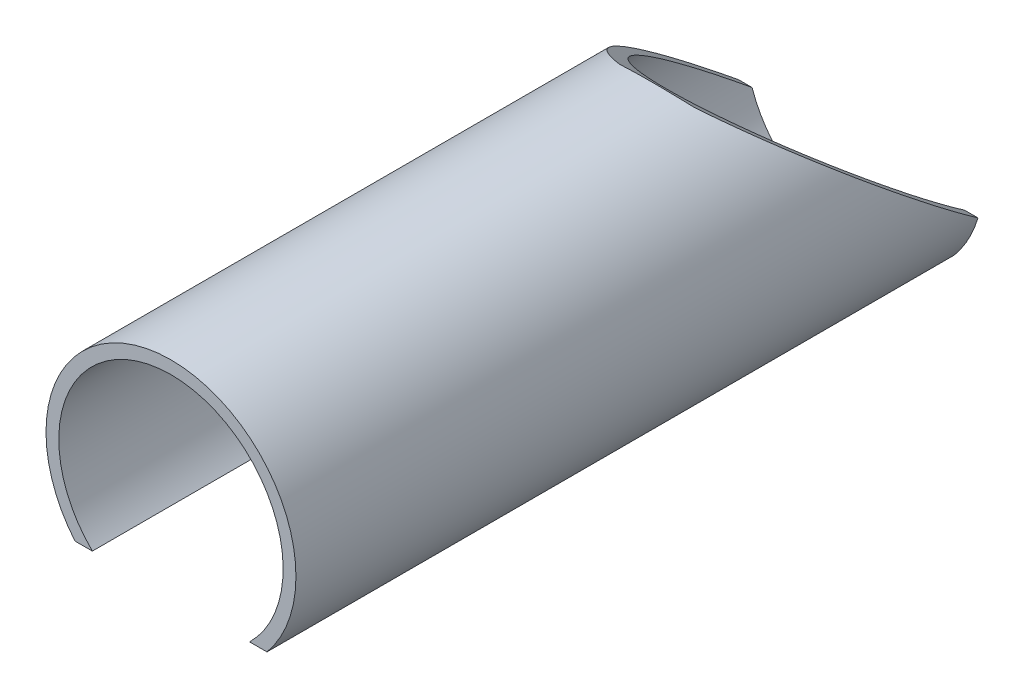
ISO-10303-21;
HEADER;
FILE_DESCRIPTION(('STEP AP214'),'2;1');
FILE_NAME('part.step','',(''),(''),'','','');
FILE_SCHEMA(('AUTOMOTIVE_DESIGN { 1 0 10303 214 1 1 1 1 }'));
ENDSEC;
DATA;
#1=APPLICATION_CONTEXT('core data for automotive mechanical design processes');
#2=APPLICATION_PROTOCOL_DEFINITION('international standard','automotive_design',2000,#1);
#3=PRODUCT_CONTEXT('',#1,'mechanical');
#4=PRODUCT('Part','Part','',(#3));
#5=PRODUCT_RELATED_PRODUCT_CATEGORY('part','',(#4));
#6=PRODUCT_DEFINITION_FORMATION('','',#4);
#7=PRODUCT_DEFINITION_CONTEXT('part definition',#1,'design');
#8=PRODUCT_DEFINITION('design','',#6,#7);
#9=PRODUCT_DEFINITION_SHAPE('','',#8);
#10=(LENGTH_UNIT() NAMED_UNIT(*) SI_UNIT(.MILLI.,.METRE.));
#11=(NAMED_UNIT(*) PLANE_ANGLE_UNIT() SI_UNIT($,.RADIAN.));
#12=(NAMED_UNIT(*) SI_UNIT($,.STERADIAN.) SOLID_ANGLE_UNIT());
#13=UNCERTAINTY_MEASURE_WITH_UNIT(LENGTH_MEASURE(1.E-05),#10,'distance_accuracy_value','');
#14=(GEOMETRIC_REPRESENTATION_CONTEXT(3) GLOBAL_UNCERTAINTY_ASSIGNED_CONTEXT((#13)) GLOBAL_UNIT_ASSIGNED_CONTEXT((#10,
#11,#12)) REPRESENTATION_CONTEXT('',''));
#15=CARTESIAN_POINT('',(0.,0.,0.));
#16=DIRECTION('',(0.,0.,1.));
#17=DIRECTION('',(1.,0.,0.));
#18=AXIS2_PLACEMENT_3D('',#15,#16,#17);
#19=CARTESIAN_POINT('',(0.,0.,0.));
#20=DIRECTION('',(0.,0.,1.));
#21=DIRECTION('',(1.,0.,0.));
#22=AXIS2_PLACEMENT_3D('',#19,#20,#21);
#23=PLANE('',#22);
#24=CARTESIAN_POINT('',(0.,0.,0.));
#25=DIRECTION('',(0.,0.,1.));
#26=DIRECTION('',(1.,0.,0.));
#27=AXIS2_PLACEMENT_3D('',#24,#25,#26);
#28=CIRCLE('',#27,16.);
#29=CARTESIAN_POINT('',(-15.323253459695,-4.60411809252802,0.));
#30=VERTEX_POINT('',#29);
#31=CARTESIAN_POINT('',(-12.2910717549572,-10.2435128307867,0.));
#32=VERTEX_POINT('',#31);
#33=EDGE_CURVE('E126',#30,#32,#28,.T.);
#34=ORIENTED_EDGE('',*,*,#33,.F.);
#35=DIRECTION('',(1.,0.,0.));
#36=VECTOR('',#35,1.);
#37=CARTESIAN_POINT('',(0.,-4.60411809252802,0.));
#38=LINE('',#37,#36);
#39=CARTESIAN_POINT('',(-13.6023942777689,-4.60411809252802,0.));
#40=VERTEX_POINT('',#39);
#41=EDGE_CURVE('E97',#30,#40,#38,.T.);
#42=ORIENTED_EDGE('',*,*,#41,.T.);
#43=CARTESIAN_POINT('',(0.,0.,0.));
#44=DIRECTION('',(0.,0.,1.));
#45=DIRECTION('',(1.,0.,0.));
#46=AXIS2_PLACEMENT_3D('',#43,#44,#45);
#47=CIRCLE('',#46,14.3604677325574);
#48=CARTESIAN_POINT('',(-10.0644661251023,-10.2435128307867,0.));
#49=VERTEX_POINT('',#48);
#50=EDGE_CURVE('E127',#40,#49,#47,.T.);
#51=ORIENTED_EDGE('',*,*,#50,.T.);
#52=DIRECTION('',(1.,0.,0.));
#53=VECTOR('',#52,1.);
#54=CARTESIAN_POINT('',(-19.6651176515177,-10.2435128307867,0.));
#55=LINE('',#54,#53);
#56=EDGE_CURVE('E115',#32,#49,#55,.T.);
#57=ORIENTED_EDGE('',*,*,#56,.F.);
#58=EDGE_LOOP('',(#34,#42,#51,#57));
#59=FACE_BOUND('',#58,.T.);
#60=ADVANCED_FACE('F34',(#59),#23,.F.);
#61=CARTESIAN_POINT('',(0.,0.,88.));
#62=DIRECTION('',(0.,0.,-1.));
#63=DIRECTION('',(-1.,0.,0.));
#64=AXIS2_PLACEMENT_3D('',#61,#62,#63);
#65=CYLINDRICAL_SURFACE('',#64,16.);
#66=CARTESIAN_POINT('',(12.2910717549572,-10.2435128307867,0.));
#67=VERTEX_POINT('',#66);
#68=CARTESIAN_POINT('',(15.323253459695,-4.60411809252802,0.));
#69=VERTEX_POINT('',#68);
#70=EDGE_CURVE('E109',#67,#69,#28,.T.);
#71=ORIENTED_EDGE('',*,*,#70,.T.);
#72=CARTESIAN_POINT('',(0.,0.,5.97411895194426));
#73=DIRECTION('',(0.,-0.792069937687795,0.610430351318848));
#74=DIRECTION('',(0.,-0.610430351318848,-0.792069937687795));
#75=AXIS2_PLACEMENT_3D('',#72,#73,#74);
#76=ELLIPSE('',#75,26.2110164827677,16.);
#77=CARTESIAN_POINT('',(4.73690627835601,15.2827261609332,25.8043713826055));
#78=VERTEX_POINT('',#77);
#79=EDGE_CURVE('E100',#69,#78,#76,.T.);
#80=ORIENTED_EDGE('',*,*,#79,.T.);
#81=CARTESIAN_POINT('',(0.,0.,12.73886623385));
#82=DIRECTION('',(0.,-0.649816759552955,0.760090901803263));
#83=DIRECTION('',(0.,-0.760090901803263,-0.649816759552955));
#84=AXIS2_PLACEMENT_3D('',#81,#82,#83);
#85=ELLIPSE('',#84,21.050113824598,16.);
#86=CARTESIAN_POINT('',(-4.73690627835602,15.2827261609332,25.8043713826055));
#87=VERTEX_POINT('',#86);
#88=EDGE_CURVE('E11',#78,#87,#85,.T.);
#89=ORIENTED_EDGE('',*,*,#88,.T.);
#90=EDGE_CURVE('E92',#87,#30,#76,.T.);
#91=ORIENTED_EDGE('',*,*,#90,.T.);
#92=ORIENTED_EDGE('',*,*,#33,.T.);
#93=DIRECTION('',(0.,0.,-1.));
#94=VECTOR('',#93,1.);
#95=CARTESIAN_POINT('',(-12.2910717549572,-10.2435128307867,88.));
#96=LINE('',#95,#94);
#97=CARTESIAN_POINT('',(-12.2910717549572,-10.2435128307867,88.));
#98=VERTEX_POINT('',#97);
#99=EDGE_CURVE('E119',#98,#32,#96,.T.);
#100=ORIENTED_EDGE('',*,*,#99,.F.);
#101=CARTESIAN_POINT('',(0.,0.,88.));
#102=DIRECTION('',(0.,0.,1.));
#103=DIRECTION('',(1.,0.,0.));
#104=AXIS2_PLACEMENT_3D('',#101,#102,#103);
#105=CIRCLE('',#104,16.);
#106=CARTESIAN_POINT('',(12.2910717549572,-10.2435128307867,88.));
#107=VERTEX_POINT('',#106);
#108=EDGE_CURVE('E130',#107,#98,#105,.T.);
#109=ORIENTED_EDGE('',*,*,#108,.F.);
#110=DIRECTION('',(0.,0.,-1.));
#111=VECTOR('',#110,1.);
#112=CARTESIAN_POINT('',(12.2910717549572,-10.2435128307867,88.));
#113=LINE('',#112,#111);
#114=EDGE_CURVE('E117',#67,#107,#113,.F.);
#115=ORIENTED_EDGE('',*,*,#114,.F.);
#116=EDGE_LOOP('',(#71,#80,#89,#91,#92,#100,#109,#115));
#117=FACE_BOUND('',#116,.T.);
#118=ADVANCED_FACE('F36',(#117),#65,.T.);
#119=CARTESIAN_POINT('',(0.,0.,88.));
#120=DIRECTION('',(0.,0.,1.));
#121=DIRECTION('',(1.,0.,0.));
#122=AXIS2_PLACEMENT_3D('',#119,#120,#121);
#123=PLANE('',#122);
#124=ORIENTED_EDGE('',*,*,#108,.T.);
#125=DIRECTION('',(1.,0.,0.));
#126=VECTOR('',#125,1.);
#127=CARTESIAN_POINT('',(-19.6651176515177,-10.2435128307867,88.));
#128=LINE('',#127,#126);
#129=CARTESIAN_POINT('',(-10.0644661251023,-10.2435128307867,88.));
#130=VERTEX_POINT('',#129);
#131=EDGE_CURVE('E110',#98,#130,#128,.T.);
#132=ORIENTED_EDGE('',*,*,#131,.T.);
#133=CARTESIAN_POINT('',(0.,0.,88.));
#134=DIRECTION('',(0.,0.,1.));
#135=DIRECTION('',(1.,0.,0.));
#136=AXIS2_PLACEMENT_3D('',#133,#134,#135);
#137=CIRCLE('',#136,14.3604677325574);
#138=CARTESIAN_POINT('',(10.0644661251023,-10.2435128307867,88.));
#139=VERTEX_POINT('',#138);
#140=EDGE_CURVE('E122',#139,#130,#137,.T.);
#141=ORIENTED_EDGE('',*,*,#140,.F.);
#142=EDGE_CURVE('E57',#139,#107,#128,.T.);
#143=ORIENTED_EDGE('',*,*,#142,.T.);
#144=EDGE_LOOP('',(#124,#132,#141,#143));
#145=FACE_BOUND('',#144,.T.);
#146=ADVANCED_FACE('F150',(#145),#123,.T.);
#147=CARTESIAN_POINT('',(10.0644661251023,-10.2435128307867,0.));
#148=VERTEX_POINT('',#147);
#149=CARTESIAN_POINT('',(13.6023942777689,-4.60411809252802,0.));
#150=VERTEX_POINT('',#149);
#151=EDGE_CURVE('E123',#148,#150,#47,.T.);
#152=ORIENTED_EDGE('',*,*,#151,.T.);
#153=EDGE_CURVE('E49',#150,#69,#38,.T.);
#154=ORIENTED_EDGE('',*,*,#153,.T.);
#155=ORIENTED_EDGE('',*,*,#70,.F.);
#156=EDGE_CURVE('E114',#148,#67,#55,.T.);
#157=ORIENTED_EDGE('',*,*,#156,.F.);
#158=EDGE_LOOP('',(#152,#154,#155,#157));
#159=FACE_BOUND('',#158,.T.);
#160=ADVANCED_FACE('F144',(#159),#23,.F.);
#161=CARTESIAN_POINT('',(0.,0.,0.));
#162=DIRECTION('',(0.,0.,1.));
#163=DIRECTION('',(1.,0.,0.));
#164=AXIS2_PLACEMENT_3D('',#161,#162,#163);
#165=CYLINDRICAL_SURFACE('',#164,14.3604677325574);
#166=ORIENTED_EDGE('',*,*,#50,.F.);
#167=CARTESIAN_POINT('',(0.,0.,5.97411895194426));
#168=DIRECTION('',(0.,-0.792069937687795,0.610430351318848));
#169=DIRECTION('',(0.,0.610430351318848,0.792069937687795));
#170=AXIS2_PLACEMENT_3D('',#167,#168,#169);
#171=ELLIPSE('',#170,23.5251535273948,14.3604677325574);
#172=EDGE_CURVE('E42',#40,#150,#171,.F.);
#173=ORIENTED_EDGE('',*,*,#172,.T.);
#174=ORIENTED_EDGE('',*,*,#151,.F.);
#175=DIRECTION('',(0.,0.,1.));
#176=VECTOR('',#175,1.);
#177=CARTESIAN_POINT('',(10.0644661251023,-10.2435128307867,0.));
#178=LINE('',#177,#176);
#179=EDGE_CURVE('E136',#139,#148,#178,.F.);
#180=ORIENTED_EDGE('',*,*,#179,.F.);
#181=ORIENTED_EDGE('',*,*,#140,.T.);
#182=DIRECTION('',(0.,0.,1.));
#183=VECTOR('',#182,1.);
#184=CARTESIAN_POINT('',(-10.0644661251023,-10.2435128307867,0.));
#185=LINE('',#184,#183);
#186=EDGE_CURVE('E133',#49,#130,#185,.T.);
#187=ORIENTED_EDGE('',*,*,#186,.F.);
#188=EDGE_LOOP('',(#166,#173,#174,#180,#181,#187));
#189=FACE_BOUND('',#188,.T.);
#190=ADVANCED_FACE('F140',(#189),#165,.F.);
#191=CARTESIAN_POINT('',(-19.6651176515177,-10.2435128307867,0.));
#192=DIRECTION('',(0.,-1.,0.));
#193=DIRECTION('',(0.,0.,-1.));
#194=AXIS2_PLACEMENT_3D('',#191,#192,#193);
#195=PLANE('',#194);
#196=ORIENTED_EDGE('',*,*,#99,.T.);
#197=ORIENTED_EDGE('',*,*,#56,.T.);
#198=ORIENTED_EDGE('',*,*,#186,.T.);
#199=ORIENTED_EDGE('',*,*,#131,.F.);
#200=EDGE_LOOP('',(#196,#197,#198,#199));
#201=FACE_BOUND('',#200,.T.);
#202=ADVANCED_FACE('F154',(#201),#195,.T.);
#203=ORIENTED_EDGE('',*,*,#114,.T.);
#204=ORIENTED_EDGE('',*,*,#142,.F.);
#205=ORIENTED_EDGE('',*,*,#179,.T.);
#206=ORIENTED_EDGE('',*,*,#156,.T.);
#207=EDGE_LOOP('',(#203,#204,#205,#206));
#208=FACE_BOUND('',#207,.T.);
#209=ADVANCED_FACE('F145',(#208),#195,.T.);
#210=CARTESIAN_POINT('',(-16.,20.4329158965848,30.2073705464743));
#211=DIRECTION('',(0.,-0.649816759552955,0.760090901803263));
#212=DIRECTION('',(0.,-0.760090901803263,-0.649816759552955));
#213=AXIS2_PLACEMENT_3D('',#210,#211,#212);
#214=PLANE('',#213);
#215=DIRECTION('',(1.,0.,0.));
#216=VECTOR('',#215,1.);
#217=CARTESIAN_POINT('',(-16.,15.2827261609332,25.8043713826055));
#218=LINE('',#217,#216);
#219=EDGE_CURVE('E95',#87,#78,#218,.T.);
#220=ORIENTED_EDGE('',*,*,#219,.F.);
#221=ORIENTED_EDGE('',*,*,#88,.F.);
#222=EDGE_LOOP('',(#220,#221));
#223=FACE_BOUND('',#222,.T.);
#224=ADVANCED_FACE('F104',(#223),#214,.F.);
#225=CARTESIAN_POINT('',(-16.,-11.5889632157931,-9.06325484896087));
#226=DIRECTION('',(0.,-0.792069937687795,0.610430351318848));
#227=DIRECTION('',(0.,-0.610430351318848,-0.792069937687795));
#228=AXIS2_PLACEMENT_3D('',#225,#226,#227);
#229=PLANE('',#228);
#230=ORIENTED_EDGE('',*,*,#79,.F.);
#231=ORIENTED_EDGE('',*,*,#153,.F.);
#232=ORIENTED_EDGE('',*,*,#172,.F.);
#233=ORIENTED_EDGE('',*,*,#41,.F.);
#234=ORIENTED_EDGE('',*,*,#90,.F.);
#235=ORIENTED_EDGE('',*,*,#219,.T.);
#236=EDGE_LOOP('',(#230,#231,#232,#233,#234,#235));
#237=FACE_BOUND('',#236,.T.);
#238=ADVANCED_FACE('F94',(#237),#229,.F.);
#239=CLOSED_SHELL('',(#60,#118,#146,#160,#190,#202,#209,#224,#238));
#240=MANIFOLD_SOLID_BREP('B2',#239);
#241=ADVANCED_BREP_SHAPE_REPRESENTATION('',(#18,#240),#14);
#242=SHAPE_DEFINITION_REPRESENTATION(#9,#241);
ENDSEC;
END-ISO-10303-21;
